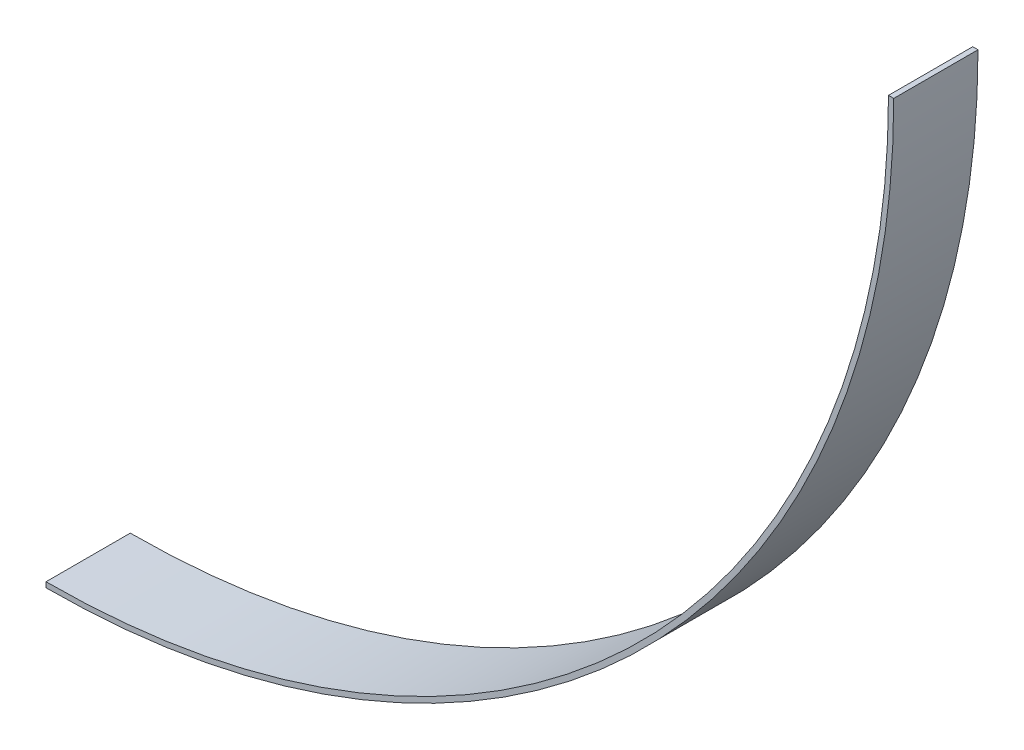
ISO-10303-21;
HEADER;
FILE_DESCRIPTION(('STEP AP214'),'2;1');
FILE_NAME('part.step','',(''),(''),'','','');
FILE_SCHEMA(('AUTOMOTIVE_DESIGN { 1 0 10303 214 1 1 1 1 }'));
ENDSEC;
DATA;
#1=APPLICATION_CONTEXT('core data for automotive mechanical design processes');
#2=APPLICATION_PROTOCOL_DEFINITION('international standard','automotive_design',2000,#1);
#3=PRODUCT_CONTEXT('',#1,'mechanical');
#4=PRODUCT('Part','Part','',(#3));
#5=PRODUCT_RELATED_PRODUCT_CATEGORY('part','',(#4));
#6=PRODUCT_DEFINITION_FORMATION('','',#4);
#7=PRODUCT_DEFINITION_CONTEXT('part definition',#1,'design');
#8=PRODUCT_DEFINITION('design','',#6,#7);
#9=PRODUCT_DEFINITION_SHAPE('','',#8);
#10=(LENGTH_UNIT() NAMED_UNIT(*) SI_UNIT(.MILLI.,.METRE.));
#11=(NAMED_UNIT(*) PLANE_ANGLE_UNIT() SI_UNIT($,.RADIAN.));
#12=(NAMED_UNIT(*) SI_UNIT($,.STERADIAN.) SOLID_ANGLE_UNIT());
#13=UNCERTAINTY_MEASURE_WITH_UNIT(LENGTH_MEASURE(1.E-05),#10,'distance_accuracy_value','');
#14=(GEOMETRIC_REPRESENTATION_CONTEXT(3) GLOBAL_UNCERTAINTY_ASSIGNED_CONTEXT((#13)) GLOBAL_UNIT_ASSIGNED_CONTEXT((#10,
#11,#12)) REPRESENTATION_CONTEXT('',''));
#15=CARTESIAN_POINT('',(0.,0.,0.));
#16=DIRECTION('',(0.,0.,1.));
#17=DIRECTION('',(1.,0.,0.));
#18=AXIS2_PLACEMENT_3D('',#15,#16,#17);
#19=CARTESIAN_POINT('',(0.,0.,25.4));
#20=DIRECTION('',(0.,0.,-1.));
#21=DIRECTION('',(-1.,0.,0.));
#22=AXIS2_PLACEMENT_3D('',#19,#20,#21);
#23=CYLINDRICAL_SURFACE('',#22,254.);
#24=CARTESIAN_POINT('',(0.,0.,0.));
#25=DIRECTION('',(0.,0.,-1.));
#26=DIRECTION('',(1.,0.,0.));
#27=AXIS2_PLACEMENT_3D('',#24,#25,#26);
#28=CIRCLE('',#27,254.);
#29=CARTESIAN_POINT('',(254.,9.48213729756731E-13,0.));
#30=VERTEX_POINT('',#29);
#31=CARTESIAN_POINT('',(0.,-254.,0.));
#32=VERTEX_POINT('',#31);
#33=EDGE_CURVE('E96',#30,#32,#28,.T.);
#34=ORIENTED_EDGE('',*,*,#33,.T.);
#35=DIRECTION('',(0.,0.,-1.));
#36=VECTOR('',#35,1.);
#37=CARTESIAN_POINT('',(0.,-254.,25.4));
#38=LINE('',#37,#36);
#39=CARTESIAN_POINT('',(0.,-254.,25.4));
#40=VERTEX_POINT('',#39);
#41=EDGE_CURVE('E11',#40,#32,#38,.T.);
#42=ORIENTED_EDGE('',*,*,#41,.F.);
#43=CARTESIAN_POINT('',(0.,0.,25.4));
#44=DIRECTION('',(0.,0.,-1.));
#45=DIRECTION('',(1.,0.,0.));
#46=AXIS2_PLACEMENT_3D('',#43,#44,#45);
#47=CIRCLE('',#46,254.);
#48=CARTESIAN_POINT('',(254.,9.48213729756731E-13,25.4));
#49=VERTEX_POINT('',#48);
#50=EDGE_CURVE('E84',#49,#40,#47,.T.);
#51=ORIENTED_EDGE('',*,*,#50,.F.);
#52=DIRECTION('',(0.,0.,-1.));
#53=VECTOR('',#52,1.);
#54=CARTESIAN_POINT('',(254.,9.48213729756731E-13,25.4));
#55=LINE('',#54,#53);
#56=EDGE_CURVE('E92',#49,#30,#55,.T.);
#57=ORIENTED_EDGE('',*,*,#56,.T.);
#58=EDGE_LOOP('',(#34,#42,#51,#57));
#59=FACE_BOUND('',#58,.T.);
#60=ADVANCED_FACE('F33',(#59),#23,.F.);
#61=CARTESIAN_POINT('',(0.,-254.,25.4));
#62=DIRECTION('',(1.,0.,0.));
#63=DIRECTION('',(0.,1.,0.));
#64=AXIS2_PLACEMENT_3D('',#61,#62,#63);
#65=PLANE('',#64);
#66=DIRECTION('',(0.,-1.,0.));
#67=VECTOR('',#66,1.);
#68=CARTESIAN_POINT('',(0.,-254.,0.));
#69=LINE('',#68,#67);
#70=CARTESIAN_POINT('',(0.,-255.5875,0.));
#71=VERTEX_POINT('',#70);
#72=EDGE_CURVE('E88',#32,#71,#69,.T.);
#73=ORIENTED_EDGE('',*,*,#72,.T.);
#74=DIRECTION('',(0.,0.,-1.));
#75=VECTOR('',#74,1.);
#76=CARTESIAN_POINT('',(0.,-255.5875,25.4));
#77=LINE('',#76,#75);
#78=CARTESIAN_POINT('',(0.,-255.5875,25.4));
#79=VERTEX_POINT('',#78);
#80=EDGE_CURVE('E41',#79,#71,#77,.T.);
#81=ORIENTED_EDGE('',*,*,#80,.F.);
#82=DIRECTION('',(0.,-1.,0.));
#83=VECTOR('',#82,1.);
#84=CARTESIAN_POINT('',(0.,-254.,25.4));
#85=LINE('',#84,#83);
#86=EDGE_CURVE('E79',#40,#79,#85,.T.);
#87=ORIENTED_EDGE('',*,*,#86,.F.);
#88=ORIENTED_EDGE('',*,*,#41,.T.);
#89=EDGE_LOOP('',(#73,#81,#87,#88));
#90=FACE_BOUND('',#89,.T.);
#91=ADVANCED_FACE('F87',(#90),#65,.F.);
#92=CARTESIAN_POINT('',(0.,0.,25.4));
#93=DIRECTION('',(0.,0.,-1.));
#94=DIRECTION('',(-1.,0.,0.));
#95=AXIS2_PLACEMENT_3D('',#92,#93,#94);
#96=CYLINDRICAL_SURFACE('',#95,255.5875);
#97=CARTESIAN_POINT('',(0.,0.,0.));
#98=DIRECTION('',(0.,0.,1.));
#99=DIRECTION('',(1.,0.,0.));
#100=AXIS2_PLACEMENT_3D('',#97,#98,#99);
#101=CIRCLE('',#100,255.5875);
#102=CARTESIAN_POINT('',(255.5875,9.08029207380423E-13,0.));
#103=VERTEX_POINT('',#102);
#104=EDGE_CURVE('E66',#71,#103,#101,.T.);
#105=ORIENTED_EDGE('',*,*,#104,.T.);
#106=DIRECTION('',(0.,0.,-1.));
#107=VECTOR('',#106,1.);
#108=CARTESIAN_POINT('',(255.5875,9.08029207380423E-13,25.4));
#109=LINE('',#108,#107);
#110=CARTESIAN_POINT('',(255.5875,9.08029207380423E-13,25.4));
#111=VERTEX_POINT('',#110);
#112=EDGE_CURVE('E89',#111,#103,#109,.T.);
#113=ORIENTED_EDGE('',*,*,#112,.F.);
#114=CARTESIAN_POINT('',(0.,0.,25.4));
#115=DIRECTION('',(0.,0.,1.));
#116=DIRECTION('',(1.,0.,0.));
#117=AXIS2_PLACEMENT_3D('',#114,#115,#116);
#118=CIRCLE('',#117,255.5875);
#119=EDGE_CURVE('E82',#79,#111,#118,.T.);
#120=ORIENTED_EDGE('',*,*,#119,.F.);
#121=ORIENTED_EDGE('',*,*,#80,.T.);
#122=EDGE_LOOP('',(#105,#113,#120,#121));
#123=FACE_BOUND('',#122,.T.);
#124=ADVANCED_FACE('F90',(#123),#96,.T.);
#125=CARTESIAN_POINT('',(254.,9.48213729756731E-13,25.4));
#126=DIRECTION('',(0.,-1.,0.));
#127=DIRECTION('',(1.,0.,0.));
#128=AXIS2_PLACEMENT_3D('',#125,#126,#127);
#129=PLANE('',#128);
#130=DIRECTION('',(-1.,0.,0.));
#131=VECTOR('',#130,1.);
#132=CARTESIAN_POINT('',(254.,9.48213729756731E-13,0.));
#133=LINE('',#132,#131);
#134=EDGE_CURVE('E72',#103,#30,#133,.T.);
#135=ORIENTED_EDGE('',*,*,#134,.T.);
#136=ORIENTED_EDGE('',*,*,#56,.F.);
#137=DIRECTION('',(-1.,0.,0.));
#138=VECTOR('',#137,1.);
#139=CARTESIAN_POINT('',(254.,9.48213729756731E-13,25.4));
#140=LINE('',#139,#138);
#141=EDGE_CURVE('E49',#111,#49,#140,.T.);
#142=ORIENTED_EDGE('',*,*,#141,.F.);
#143=ORIENTED_EDGE('',*,*,#112,.T.);
#144=EDGE_LOOP('',(#135,#136,#142,#143));
#145=FACE_BOUND('',#144,.T.);
#146=ADVANCED_FACE('F103',(#145),#129,.F.);
#147=CARTESIAN_POINT('',(0.,0.,25.4));
#148=DIRECTION('',(0.,0.,1.));
#149=DIRECTION('',(1.,0.,0.));
#150=AXIS2_PLACEMENT_3D('',#147,#148,#149);
#151=PLANE('',#150);
#152=ORIENTED_EDGE('',*,*,#50,.T.);
#153=ORIENTED_EDGE('',*,*,#86,.T.);
#154=ORIENTED_EDGE('',*,*,#119,.T.);
#155=ORIENTED_EDGE('',*,*,#141,.T.);
#156=EDGE_LOOP('',(#152,#153,#154,#155));
#157=FACE_BOUND('',#156,.T.);
#158=ADVANCED_FACE('F80',(#157),#151,.T.);
#159=CARTESIAN_POINT('',(0.,0.,0.));
#160=DIRECTION('',(0.,0.,1.));
#161=DIRECTION('',(1.,0.,0.));
#162=AXIS2_PLACEMENT_3D('',#159,#160,#161);
#163=PLANE('',#162);
#164=ORIENTED_EDGE('',*,*,#33,.F.);
#165=ORIENTED_EDGE('',*,*,#134,.F.);
#166=ORIENTED_EDGE('',*,*,#104,.F.);
#167=ORIENTED_EDGE('',*,*,#72,.F.);
#168=EDGE_LOOP('',(#164,#165,#166,#167));
#169=FACE_BOUND('',#168,.T.);
#170=ADVANCED_FACE('F106',(#169),#163,.F.);
#171=CLOSED_SHELL('',(#60,#91,#124,#146,#158,#170));
#172=MANIFOLD_SOLID_BREP('B2',#171);
#173=ADVANCED_BREP_SHAPE_REPRESENTATION('',(#18,#172),#14);
#174=SHAPE_DEFINITION_REPRESENTATION(#9,#173);
ENDSEC;
END-ISO-10303-21;
